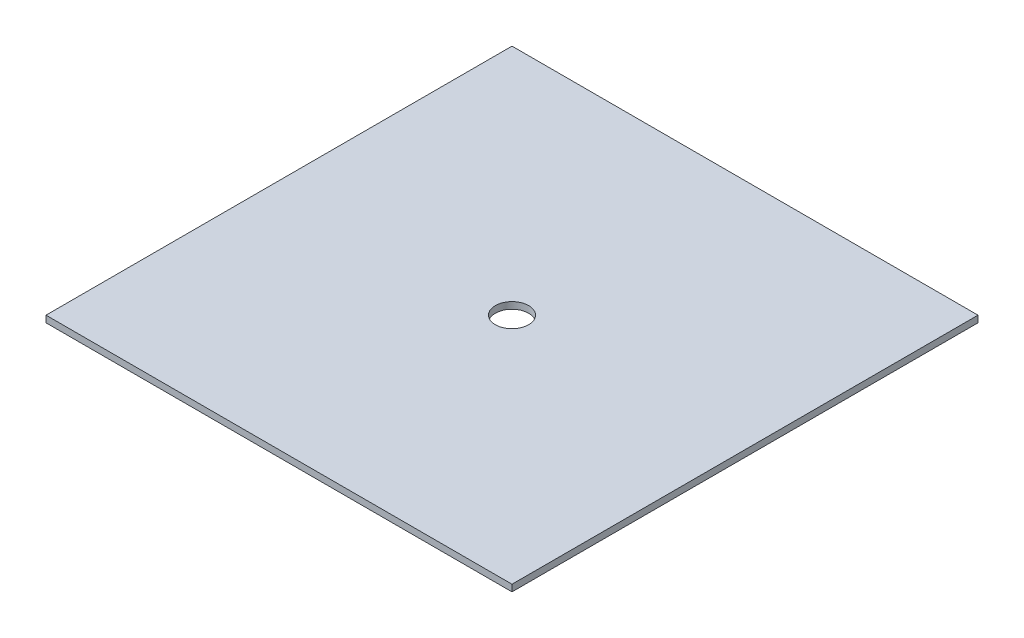
ISO-10303-21;
HEADER;
FILE_DESCRIPTION(('STEP AP214'),'2;1');
FILE_NAME('part.step','',(''),(''),'','','');
FILE_SCHEMA(('AUTOMOTIVE_DESIGN { 1 0 10303 214 1 1 1 1 }'));
ENDSEC;
DATA;
#1=APPLICATION_CONTEXT('core data for automotive mechanical design processes');
#2=APPLICATION_PROTOCOL_DEFINITION('international standard','automotive_design',2000,#1);
#3=PRODUCT_CONTEXT('',#1,'mechanical');
#4=PRODUCT('Part','Part','',(#3));
#5=PRODUCT_RELATED_PRODUCT_CATEGORY('part','',(#4));
#6=PRODUCT_DEFINITION_FORMATION('','',#4);
#7=PRODUCT_DEFINITION_CONTEXT('part definition',#1,'design');
#8=PRODUCT_DEFINITION('design','',#6,#7);
#9=PRODUCT_DEFINITION_SHAPE('','',#8);
#10=(LENGTH_UNIT() NAMED_UNIT(*) SI_UNIT(.MILLI.,.METRE.));
#11=(NAMED_UNIT(*) PLANE_ANGLE_UNIT() SI_UNIT($,.RADIAN.));
#12=(NAMED_UNIT(*) SI_UNIT($,.STERADIAN.) SOLID_ANGLE_UNIT());
#13=UNCERTAINTY_MEASURE_WITH_UNIT(LENGTH_MEASURE(1.E-05),#10,'distance_accuracy_value','');
#14=(GEOMETRIC_REPRESENTATION_CONTEXT(3) GLOBAL_UNCERTAINTY_ASSIGNED_CONTEXT((#13)) GLOBAL_UNIT_ASSIGNED_CONTEXT((#10,
#11,#12)) REPRESENTATION_CONTEXT('',''));
#15=CARTESIAN_POINT('',(0.,0.,0.));
#16=DIRECTION('',(0.,0.,1.));
#17=DIRECTION('',(1.,0.,0.));
#18=AXIS2_PLACEMENT_3D('',#15,#16,#17);
#19=CARTESIAN_POINT('',(0.,5.,0.));
#20=DIRECTION('',(0.,1.,0.));
#21=DIRECTION('',(0.,0.,1.));
#22=AXIS2_PLACEMENT_3D('',#19,#20,#21);
#23=PLANE('',#22);
#24=DIRECTION('',(0.,0.,-1.));
#25=VECTOR('',#24,1.);
#26=CARTESIAN_POINT('',(175.,5.,-175.));
#27=LINE('',#26,#25);
#28=CARTESIAN_POINT('',(175.,5.,175.));
#29=VERTEX_POINT('',#28);
#30=CARTESIAN_POINT('',(175.,5.,-175.));
#31=VERTEX_POINT('',#30);
#32=EDGE_CURVE('E96',#29,#31,#27,.T.);
#33=ORIENTED_EDGE('',*,*,#32,.T.);
#34=DIRECTION('',(-1.,0.,0.));
#35=VECTOR('',#34,1.);
#36=CARTESIAN_POINT('',(-175.,5.,-175.));
#37=LINE('',#36,#35);
#38=CARTESIAN_POINT('',(-175.,5.,-175.));
#39=VERTEX_POINT('',#38);
#40=EDGE_CURVE('E91',#31,#39,#37,.T.);
#41=ORIENTED_EDGE('',*,*,#40,.T.);
#42=DIRECTION('',(0.,0.,1.));
#43=VECTOR('',#42,1.);
#44=CARTESIAN_POINT('',(-175.,5.,-175.));
#45=LINE('',#44,#43);
#46=CARTESIAN_POINT('',(-175.,5.,175.));
#47=VERTEX_POINT('',#46);
#48=EDGE_CURVE('E94',#39,#47,#45,.T.);
#49=ORIENTED_EDGE('',*,*,#48,.T.);
#50=DIRECTION('',(1.,0.,0.));
#51=VECTOR('',#50,1.);
#52=CARTESIAN_POINT('',(-175.,5.,175.));
#53=LINE('',#52,#51);
#54=EDGE_CURVE('E61',#47,#29,#53,.T.);
#55=ORIENTED_EDGE('',*,*,#54,.T.);
#56=EDGE_LOOP('',(#33,#41,#49,#55));
#57=FACE_BOUND('',#56,.T.);
#58=CARTESIAN_POINT('',(0.,5.,0.));
#59=DIRECTION('',(0.,1.,0.));
#60=DIRECTION('',(0.,0.,1.));
#61=AXIS2_PLACEMENT_3D('',#58,#59,#60);
#62=CIRCLE('',#61,12.5);
#63=CARTESIAN_POINT('',(0.,5.,12.5));
#64=VERTEX_POINT('',#63);
#65=EDGE_CURVE('E116',#64,#64,#62,.T.);
#66=ORIENTED_EDGE('',*,*,#65,.F.);
#67=EDGE_LOOP('',(#66));
#68=FACE_BOUND('',#67,.T.);
#69=ADVANCED_FACE('F43',(#57,#68),#23,.T.);
#70=CARTESIAN_POINT('',(0.,0.,0.));
#71=DIRECTION('',(0.,1.,0.));
#72=DIRECTION('',(0.,0.,1.));
#73=AXIS2_PLACEMENT_3D('',#70,#71,#72);
#74=PLANE('',#73);
#75=DIRECTION('',(0.,0.,-1.));
#76=VECTOR('',#75,1.);
#77=CARTESIAN_POINT('',(175.,0.,-175.));
#78=LINE('',#77,#76);
#79=CARTESIAN_POINT('',(175.,0.,175.));
#80=VERTEX_POINT('',#79);
#81=CARTESIAN_POINT('',(175.,0.,-175.));
#82=VERTEX_POINT('',#81);
#83=EDGE_CURVE('E112',#80,#82,#78,.T.);
#84=ORIENTED_EDGE('',*,*,#83,.F.);
#85=DIRECTION('',(1.,0.,0.));
#86=VECTOR('',#85,1.);
#87=CARTESIAN_POINT('',(-175.,0.,175.));
#88=LINE('',#87,#86);
#89=CARTESIAN_POINT('',(-175.,0.,175.));
#90=VERTEX_POINT('',#89);
#91=EDGE_CURVE('E84',#90,#80,#88,.T.);
#92=ORIENTED_EDGE('',*,*,#91,.F.);
#93=DIRECTION('',(0.,0.,1.));
#94=VECTOR('',#93,1.);
#95=CARTESIAN_POINT('',(-175.,0.,-175.));
#96=LINE('',#95,#94);
#97=CARTESIAN_POINT('',(-175.,0.,-175.));
#98=VERTEX_POINT('',#97);
#99=EDGE_CURVE('E78',#98,#90,#96,.T.);
#100=ORIENTED_EDGE('',*,*,#99,.F.);
#101=DIRECTION('',(-1.,0.,0.));
#102=VECTOR('',#101,1.);
#103=CARTESIAN_POINT('',(-175.,0.,-175.));
#104=LINE('',#103,#102);
#105=EDGE_CURVE('E101',#82,#98,#104,.T.);
#106=ORIENTED_EDGE('',*,*,#105,.F.);
#107=EDGE_LOOP('',(#84,#92,#100,#106));
#108=FACE_BOUND('',#107,.T.);
#109=CARTESIAN_POINT('',(0.,0.,0.));
#110=DIRECTION('',(0.,1.,0.));
#111=DIRECTION('',(0.,0.,1.));
#112=AXIS2_PLACEMENT_3D('',#109,#110,#111);
#113=CIRCLE('',#112,12.5);
#114=CARTESIAN_POINT('',(0.,0.,12.5));
#115=VERTEX_POINT('',#114);
#116=EDGE_CURVE('E134',#115,#115,#113,.T.);
#117=ORIENTED_EDGE('',*,*,#116,.T.);
#118=EDGE_LOOP('',(#117));
#119=FACE_BOUND('',#118,.T.);
#120=ADVANCED_FACE('F129',(#108,#119),#74,.F.);
#121=CARTESIAN_POINT('',(175.,5.,-175.));
#122=DIRECTION('',(-1.,0.,0.));
#123=DIRECTION('',(0.,0.,1.));
#124=AXIS2_PLACEMENT_3D('',#121,#122,#123);
#125=PLANE('',#124);
#126=ORIENTED_EDGE('',*,*,#83,.T.);
#127=DIRECTION('',(0.,-1.,0.));
#128=VECTOR('',#127,1.);
#129=CARTESIAN_POINT('',(175.,5.,-175.));
#130=LINE('',#129,#128);
#131=EDGE_CURVE('E11',#31,#82,#130,.T.);
#132=ORIENTED_EDGE('',*,*,#131,.F.);
#133=ORIENTED_EDGE('',*,*,#32,.F.);
#134=DIRECTION('',(0.,-1.,0.));
#135=VECTOR('',#134,1.);
#136=CARTESIAN_POINT('',(175.,5.,175.));
#137=LINE('',#136,#135);
#138=EDGE_CURVE('E108',#29,#80,#137,.T.);
#139=ORIENTED_EDGE('',*,*,#138,.T.);
#140=EDGE_LOOP('',(#126,#132,#133,#139));
#141=FACE_BOUND('',#140,.T.);
#142=ADVANCED_FACE('F45',(#141),#125,.F.);
#143=CARTESIAN_POINT('',(-175.,5.,-175.));
#144=DIRECTION('',(0.,0.,1.));
#145=DIRECTION('',(1.,0.,0.));
#146=AXIS2_PLACEMENT_3D('',#143,#144,#145);
#147=PLANE('',#146);
#148=ORIENTED_EDGE('',*,*,#105,.T.);
#149=DIRECTION('',(0.,-1.,0.));
#150=VECTOR('',#149,1.);
#151=CARTESIAN_POINT('',(-175.,5.,-175.));
#152=LINE('',#151,#150);
#153=EDGE_CURVE('E53',#39,#98,#152,.T.);
#154=ORIENTED_EDGE('',*,*,#153,.F.);
#155=ORIENTED_EDGE('',*,*,#40,.F.);
#156=ORIENTED_EDGE('',*,*,#131,.T.);
#157=EDGE_LOOP('',(#148,#154,#155,#156));
#158=FACE_BOUND('',#157,.T.);
#159=ADVANCED_FACE('F100',(#158),#147,.F.);
#160=CARTESIAN_POINT('',(-175.,5.,-175.));
#161=DIRECTION('',(1.,0.,0.));
#162=DIRECTION('',(0.,0.,-1.));
#163=AXIS2_PLACEMENT_3D('',#160,#161,#162);
#164=PLANE('',#163);
#165=ORIENTED_EDGE('',*,*,#99,.T.);
#166=DIRECTION('',(0.,-1.,0.));
#167=VECTOR('',#166,1.);
#168=CARTESIAN_POINT('',(-175.,5.,175.));
#169=LINE('',#168,#167);
#170=EDGE_CURVE('E103',#47,#90,#169,.T.);
#171=ORIENTED_EDGE('',*,*,#170,.F.);
#172=ORIENTED_EDGE('',*,*,#48,.F.);
#173=ORIENTED_EDGE('',*,*,#153,.T.);
#174=EDGE_LOOP('',(#165,#171,#172,#173));
#175=FACE_BOUND('',#174,.T.);
#176=ADVANCED_FACE('F104',(#175),#164,.F.);
#177=CARTESIAN_POINT('',(-175.,5.,175.));
#178=DIRECTION('',(0.,0.,-1.));
#179=DIRECTION('',(-1.,0.,0.));
#180=AXIS2_PLACEMENT_3D('',#177,#178,#179);
#181=PLANE('',#180);
#182=ORIENTED_EDGE('',*,*,#91,.T.);
#183=ORIENTED_EDGE('',*,*,#138,.F.);
#184=ORIENTED_EDGE('',*,*,#54,.F.);
#185=ORIENTED_EDGE('',*,*,#170,.T.);
#186=EDGE_LOOP('',(#182,#183,#184,#185));
#187=FACE_BOUND('',#186,.T.);
#188=ADVANCED_FACE('F126',(#187),#181,.F.);
#189=CARTESIAN_POINT('',(0.,5.,0.));
#190=DIRECTION('',(0.,-1.,0.));
#191=DIRECTION('',(0.,0.,-1.));
#192=AXIS2_PLACEMENT_3D('',#189,#190,#191);
#193=CYLINDRICAL_SURFACE('',#192,12.5);
#194=ORIENTED_EDGE('',*,*,#65,.T.);
#195=EDGE_LOOP('',(#194));
#196=FACE_BOUND('',#195,.T.);
#197=ORIENTED_EDGE('',*,*,#116,.F.);
#198=EDGE_LOOP('',(#197));
#199=FACE_BOUND('',#198,.T.);
#200=ADVANCED_FACE('F142',(#196,#199),#193,.F.);
#201=CLOSED_SHELL('',(#69,#120,#142,#159,#176,#188,#200));
#202=MANIFOLD_SOLID_BREP('B2',#201);
#203=ADVANCED_BREP_SHAPE_REPRESENTATION('',(#18,#202),#14);
#204=SHAPE_DEFINITION_REPRESENTATION(#9,#203);
ENDSEC;
END-ISO-10303-21;
